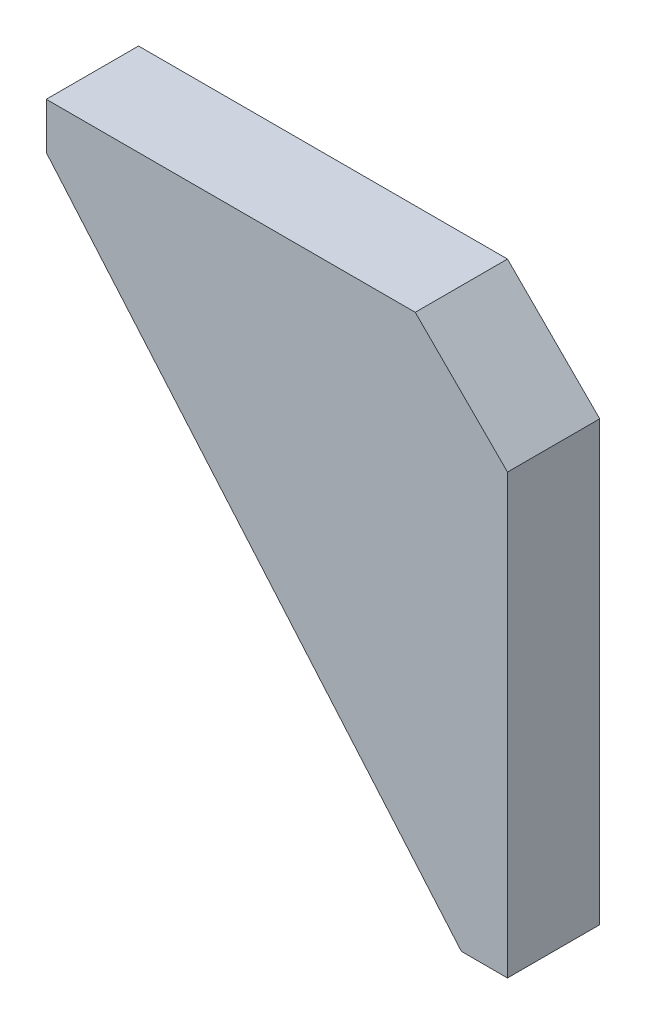
ISO-10303-21;
HEADER;
FILE_DESCRIPTION(('STEP AP214'),'2;1');
FILE_NAME('part.step','',(''),(''),'','','');
FILE_SCHEMA(('AUTOMOTIVE_DESIGN { 1 0 10303 214 1 1 1 1 }'));
ENDSEC;
DATA;
#1=APPLICATION_CONTEXT('core data for automotive mechanical design processes');
#2=APPLICATION_PROTOCOL_DEFINITION('international standard','automotive_design',2000,#1);
#3=PRODUCT_CONTEXT('',#1,'mechanical');
#4=PRODUCT('Part','Part','',(#3));
#5=PRODUCT_RELATED_PRODUCT_CATEGORY('part','',(#4));
#6=PRODUCT_DEFINITION_FORMATION('','',#4);
#7=PRODUCT_DEFINITION_CONTEXT('part definition',#1,'design');
#8=PRODUCT_DEFINITION('design','',#6,#7);
#9=PRODUCT_DEFINITION_SHAPE('','',#8);
#10=(LENGTH_UNIT() NAMED_UNIT(*) SI_UNIT(.MILLI.,.METRE.));
#11=(NAMED_UNIT(*) PLANE_ANGLE_UNIT() SI_UNIT($,.RADIAN.));
#12=(NAMED_UNIT(*) SI_UNIT($,.STERADIAN.) SOLID_ANGLE_UNIT());
#13=UNCERTAINTY_MEASURE_WITH_UNIT(LENGTH_MEASURE(1.E-05),#10,'distance_accuracy_value','');
#14=(GEOMETRIC_REPRESENTATION_CONTEXT(3) GLOBAL_UNCERTAINTY_ASSIGNED_CONTEXT((#13)) GLOBAL_UNIT_ASSIGNED_CONTEXT((#10,
#11,#12)) REPRESENTATION_CONTEXT('',''));
#15=CARTESIAN_POINT('',(0.,0.,0.));
#16=DIRECTION('',(0.,0.,1.));
#17=DIRECTION('',(1.,0.,0.));
#18=AXIS2_PLACEMENT_3D('',#15,#16,#17);
#19=CARTESIAN_POINT('',(-50.,-5.,-5.));
#20=DIRECTION('',(-1.,0.,0.));
#21=DIRECTION('',(0.,0.,1.));
#22=AXIS2_PLACEMENT_3D('',#19,#20,#21);
#23=PLANE('',#22);
#24=DIRECTION('',(0.,-1.,0.));
#25=VECTOR('',#24,1.);
#26=CARTESIAN_POINT('',(-50.,-5.,5.));
#27=LINE('',#26,#25);
#28=CARTESIAN_POINT('',(-50.,0.,5.));
#29=VERTEX_POINT('',#28);
#30=CARTESIAN_POINT('',(-50.,-5.,5.));
#31=VERTEX_POINT('',#30);
#32=EDGE_CURVE('E144',#29,#31,#27,.T.);
#33=ORIENTED_EDGE('',*,*,#32,.F.);
#34=DIRECTION('',(0.,0.,1.));
#35=VECTOR('',#34,1.);
#36=CARTESIAN_POINT('',(-50.,0.,-5.));
#37=LINE('',#36,#35);
#38=CARTESIAN_POINT('',(-50.,0.,-5.));
#39=VERTEX_POINT('',#38);
#40=EDGE_CURVE('E127',#39,#29,#37,.T.);
#41=ORIENTED_EDGE('',*,*,#40,.F.);
#42=DIRECTION('',(0.,-1.,0.));
#43=VECTOR('',#42,1.);
#44=CARTESIAN_POINT('',(-50.,-5.,-5.));
#45=LINE('',#44,#43);
#46=CARTESIAN_POINT('',(-50.,-5.,-5.));
#47=VERTEX_POINT('',#46);
#48=EDGE_CURVE('E119',#39,#47,#45,.T.);
#49=ORIENTED_EDGE('',*,*,#48,.T.);
#50=DIRECTION('',(0.,0.,1.));
#51=VECTOR('',#50,1.);
#52=CARTESIAN_POINT('',(-50.,-5.,-5.));
#53=LINE('',#52,#51);
#54=EDGE_CURVE('E101',#47,#31,#53,.T.);
#55=ORIENTED_EDGE('',*,*,#54,.T.);
#56=EDGE_LOOP('',(#33,#41,#49,#55));
#57=FACE_BOUND('',#56,.T.);
#58=ADVANCED_FACE('F48',(#57),#23,.T.);
#59=CARTESIAN_POINT('',(-50.,0.,-5.));
#60=DIRECTION('',(0.,1.,0.));
#61=DIRECTION('',(0.,0.,1.));
#62=AXIS2_PLACEMENT_3D('',#59,#60,#61);
#63=PLANE('',#62);
#64=DIRECTION('',(-1.,0.,0.));
#65=VECTOR('',#64,1.);
#66=CARTESIAN_POINT('',(-50.,0.,5.));
#67=LINE('',#66,#65);
#68=CARTESIAN_POINT('',(-10.,0.,5.));
#69=VERTEX_POINT('',#68);
#70=EDGE_CURVE('E129',#69,#29,#67,.T.);
#71=ORIENTED_EDGE('',*,*,#70,.F.);
#72=DIRECTION('',(0.,0.,-1.));
#73=VECTOR('',#72,1.);
#74=CARTESIAN_POINT('',(-10.,0.,-5.));
#75=LINE('',#74,#73);
#76=CARTESIAN_POINT('',(-10.,0.,-5.));
#77=VERTEX_POINT('',#76);
#78=EDGE_CURVE('E58',#69,#77,#75,.T.);
#79=ORIENTED_EDGE('',*,*,#78,.T.);
#80=DIRECTION('',(-1.,0.,0.));
#81=VECTOR('',#80,1.);
#82=CARTESIAN_POINT('',(-50.,0.,-5.));
#83=LINE('',#82,#81);
#84=EDGE_CURVE('E113',#77,#39,#83,.T.);
#85=ORIENTED_EDGE('',*,*,#84,.T.);
#86=ORIENTED_EDGE('',*,*,#40,.T.);
#87=EDGE_LOOP('',(#71,#79,#85,#86));
#88=FACE_BOUND('',#87,.T.);
#89=ADVANCED_FACE('F196',(#88),#63,.T.);
#90=CARTESIAN_POINT('',(0.,0.,-5.));
#91=DIRECTION('',(1.,0.,0.));
#92=DIRECTION('',(0.,1.,0.));
#93=AXIS2_PLACEMENT_3D('',#90,#91,#92);
#94=PLANE('',#93);
#95=DIRECTION('',(0.,1.,0.));
#96=VECTOR('',#95,1.);
#97=CARTESIAN_POINT('',(0.,0.,-5.));
#98=LINE('',#97,#96);
#99=CARTESIAN_POINT('',(0.,-57.5,-5.));
#100=VERTEX_POINT('',#99);
#101=CARTESIAN_POINT('',(0.,-10.,-5.));
#102=VERTEX_POINT('',#101);
#103=EDGE_CURVE('E138',#100,#102,#98,.T.);
#104=ORIENTED_EDGE('',*,*,#103,.T.);
#105=DIRECTION('',(0.,0.,1.));
#106=VECTOR('',#105,1.);
#107=CARTESIAN_POINT('',(0.,-10.,-5.));
#108=LINE('',#107,#106);
#109=CARTESIAN_POINT('',(0.,-10.,5.));
#110=VERTEX_POINT('',#109);
#111=EDGE_CURVE('E157',#102,#110,#108,.T.);
#112=ORIENTED_EDGE('',*,*,#111,.T.);
#113=DIRECTION('',(0.,1.,0.));
#114=VECTOR('',#113,1.);
#115=CARTESIAN_POINT('',(0.,0.,5.));
#116=LINE('',#115,#114);
#117=CARTESIAN_POINT('',(0.,-57.5,5.));
#118=VERTEX_POINT('',#117);
#119=EDGE_CURVE('E133',#118,#110,#116,.T.);
#120=ORIENTED_EDGE('',*,*,#119,.F.);
#121=DIRECTION('',(0.,0.,1.));
#122=VECTOR('',#121,1.);
#123=CARTESIAN_POINT('',(0.,-57.5,-5.));
#124=LINE('',#123,#122);
#125=EDGE_CURVE('E158',#100,#118,#124,.T.);
#126=ORIENTED_EDGE('',*,*,#125,.F.);
#127=EDGE_LOOP('',(#104,#112,#120,#126));
#128=FACE_BOUND('',#127,.T.);
#129=ADVANCED_FACE('F183',(#128),#94,.T.);
#130=CARTESIAN_POINT('',(0.,-57.5,-5.));
#131=DIRECTION('',(0.,-1.,0.));
#132=DIRECTION('',(0.,0.,-1.));
#133=AXIS2_PLACEMENT_3D('',#130,#131,#132);
#134=PLANE('',#133);
#135=DIRECTION('',(1.,0.,0.));
#136=VECTOR('',#135,1.);
#137=CARTESIAN_POINT('',(0.,-57.5,5.));
#138=LINE('',#137,#136);
#139=CARTESIAN_POINT('',(-4.99999999999999,-57.5,5.));
#140=VERTEX_POINT('',#139);
#141=EDGE_CURVE('E149',#140,#118,#138,.T.);
#142=ORIENTED_EDGE('',*,*,#141,.F.);
#143=DIRECTION('',(0.,0.,1.));
#144=VECTOR('',#143,1.);
#145=CARTESIAN_POINT('',(-4.99999999999999,-57.5,-5.));
#146=LINE('',#145,#144);
#147=CARTESIAN_POINT('',(-4.99999999999999,-57.5,-5.));
#148=VERTEX_POINT('',#147);
#149=EDGE_CURVE('E112',#148,#140,#146,.T.);
#150=ORIENTED_EDGE('',*,*,#149,.F.);
#151=DIRECTION('',(1.,0.,0.));
#152=VECTOR('',#151,1.);
#153=CARTESIAN_POINT('',(0.,-57.5,-5.));
#154=LINE('',#153,#152);
#155=EDGE_CURVE('E122',#148,#100,#154,.T.);
#156=ORIENTED_EDGE('',*,*,#155,.T.);
#157=ORIENTED_EDGE('',*,*,#125,.T.);
#158=EDGE_LOOP('',(#142,#150,#156,#157));
#159=FACE_BOUND('',#158,.T.);
#160=ADVANCED_FACE('F189',(#159),#134,.T.);
#161=CARTESIAN_POINT('',(-4.99999999999999,-57.5,-5.));
#162=DIRECTION('',(-0.759256602365297,-0.650791373455969,0.));
#163=DIRECTION('',(0.650791373455969,-0.759256602365297,0.));
#164=AXIS2_PLACEMENT_3D('',#161,#162,#163);
#165=PLANE('',#164);
#166=DIRECTION('',(0.650791373455969,-0.759256602365297,0.));
#167=VECTOR('',#166,1.);
#168=CARTESIAN_POINT('',(-4.99999999999999,-57.5,5.));
#169=LINE('',#168,#167);
#170=EDGE_CURVE('E106',#31,#140,#169,.T.);
#171=ORIENTED_EDGE('',*,*,#170,.F.);
#172=ORIENTED_EDGE('',*,*,#54,.F.);
#173=DIRECTION('',(0.650791373455969,-0.759256602365297,0.));
#174=VECTOR('',#173,1.);
#175=CARTESIAN_POINT('',(-4.99999999999999,-57.5,-5.));
#176=LINE('',#175,#174);
#177=EDGE_CURVE('E104',#47,#148,#176,.T.);
#178=ORIENTED_EDGE('',*,*,#177,.T.);
#179=ORIENTED_EDGE('',*,*,#149,.T.);
#180=EDGE_LOOP('',(#171,#172,#178,#179));
#181=FACE_BOUND('',#180,.T.);
#182=ADVANCED_FACE('F103',(#181),#165,.T.);
#183=CARTESIAN_POINT('',(0.,0.,-5.));
#184=DIRECTION('',(0.,0.,-1.));
#185=DIRECTION('',(-1.,0.,0.));
#186=AXIS2_PLACEMENT_3D('',#183,#184,#185);
#187=PLANE('',#186);
#188=ORIENTED_EDGE('',*,*,#84,.F.);
#189=DIRECTION('',(-0.707106781186549,0.707106781186546,0.));
#190=VECTOR('',#189,1.);
#191=CARTESIAN_POINT('',(-5.00000000000001,-5.00000000000002,-5.));
#192=LINE('',#191,#190);
#193=EDGE_CURVE('E11',#77,#102,#192,.F.);
#194=ORIENTED_EDGE('',*,*,#193,.T.);
#195=ORIENTED_EDGE('',*,*,#103,.F.);
#196=ORIENTED_EDGE('',*,*,#155,.F.);
#197=ORIENTED_EDGE('',*,*,#177,.F.);
#198=ORIENTED_EDGE('',*,*,#48,.F.);
#199=EDGE_LOOP('',(#188,#194,#195,#196,#197,#198));
#200=FACE_BOUND('',#199,.T.);
#201=ADVANCED_FACE('F118',(#200),#187,.T.);
#202=CARTESIAN_POINT('',(0.,0.,5.));
#203=DIRECTION('',(0.,0.,-1.));
#204=DIRECTION('',(-1.,0.,0.));
#205=AXIS2_PLACEMENT_3D('',#202,#203,#204);
#206=PLANE('',#205);
#207=ORIENTED_EDGE('',*,*,#119,.T.);
#208=DIRECTION('',(0.707106781186549,-0.707106781186546,0.));
#209=VECTOR('',#208,1.);
#210=CARTESIAN_POINT('',(0.,-10.,5.));
#211=LINE('',#210,#209);
#212=EDGE_CURVE('E72',#110,#69,#211,.F.);
#213=ORIENTED_EDGE('',*,*,#212,.T.);
#214=ORIENTED_EDGE('',*,*,#70,.T.);
#215=ORIENTED_EDGE('',*,*,#32,.T.);
#216=ORIENTED_EDGE('',*,*,#170,.T.);
#217=ORIENTED_EDGE('',*,*,#141,.T.);
#218=EDGE_LOOP('',(#207,#213,#214,#215,#216,#217));
#219=FACE_BOUND('',#218,.T.);
#220=ADVANCED_FACE('F186',(#219),#206,.F.);
#221=CARTESIAN_POINT('',(0.,-10.,-5.));
#222=DIRECTION('',(-0.707106781186546,-0.707106781186549,0.));
#223=DIRECTION('',(0.,0.,1.));
#224=AXIS2_PLACEMENT_3D('',#221,#222,#223);
#225=PLANE('',#224);
#226=ORIENTED_EDGE('',*,*,#193,.F.);
#227=ORIENTED_EDGE('',*,*,#78,.F.);
#228=ORIENTED_EDGE('',*,*,#212,.F.);
#229=ORIENTED_EDGE('',*,*,#111,.F.);
#230=EDGE_LOOP('',(#226,#227,#228,#229));
#231=FACE_BOUND('',#230,.T.);
#232=ADVANCED_FACE('F51',(#231),#225,.F.);
#233=CLOSED_SHELL('',(#58,#89,#129,#160,#182,#201,#220,#232));
#234=MANIFOLD_SOLID_BREP('B2',#233);
#235=ADVANCED_BREP_SHAPE_REPRESENTATION('',(#18,#234),#14);
#236=SHAPE_DEFINITION_REPRESENTATION(#9,#235);
ENDSEC;
END-ISO-10303-21;
